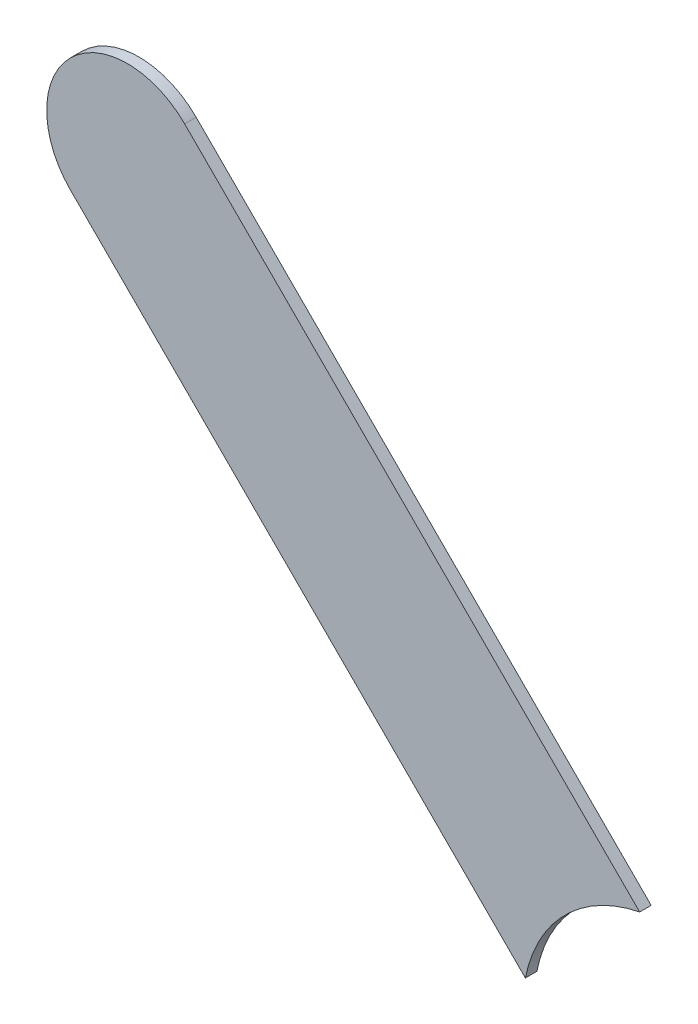
ISO-10303-21;
HEADER;
FILE_DESCRIPTION(('STEP AP214'),'2;1');
FILE_NAME('part.step','',(''),(''),'','','');
FILE_SCHEMA(('AUTOMOTIVE_DESIGN { 1 0 10303 214 1 1 1 1 }'));
ENDSEC;
DATA;
#1=APPLICATION_CONTEXT('core data for automotive mechanical design processes');
#2=APPLICATION_PROTOCOL_DEFINITION('international standard','automotive_design',2000,#1);
#3=PRODUCT_CONTEXT('',#1,'mechanical');
#4=PRODUCT('Part','Part','',(#3));
#5=PRODUCT_RELATED_PRODUCT_CATEGORY('part','',(#4));
#6=PRODUCT_DEFINITION_FORMATION('','',#4);
#7=PRODUCT_DEFINITION_CONTEXT('part definition',#1,'design');
#8=PRODUCT_DEFINITION('design','',#6,#7);
#9=PRODUCT_DEFINITION_SHAPE('','',#8);
#10=(LENGTH_UNIT() NAMED_UNIT(*) SI_UNIT(.MILLI.,.METRE.));
#11=(NAMED_UNIT(*) PLANE_ANGLE_UNIT() SI_UNIT($,.RADIAN.));
#12=(NAMED_UNIT(*) SI_UNIT($,.STERADIAN.) SOLID_ANGLE_UNIT());
#13=UNCERTAINTY_MEASURE_WITH_UNIT(LENGTH_MEASURE(1.E-05),#10,'distance_accuracy_value','');
#14=(GEOMETRIC_REPRESENTATION_CONTEXT(3) GLOBAL_UNCERTAINTY_ASSIGNED_CONTEXT((#13)) GLOBAL_UNIT_ASSIGNED_CONTEXT((#10,
#11,#12)) REPRESENTATION_CONTEXT('',''));
#15=CARTESIAN_POINT('',(0.,0.,0.));
#16=DIRECTION('',(0.,0.,1.));
#17=DIRECTION('',(1.,0.,0.));
#18=AXIS2_PLACEMENT_3D('',#15,#16,#17);
#19=CARTESIAN_POINT('',(46.2622392,105.82322244,0.));
#20=DIRECTION('',(0.707106781186546,0.707106781186549,0.));
#21=DIRECTION('',(0.707106781186549,-0.707106781186546,0.));
#22=AXIS2_PLACEMENT_3D('',#19,#20,#21);
#23=PLANE('',#22);
#24=DIRECTION('',(0.707106781186549,-0.707106781186546,0.));
#25=VECTOR('',#24,1.);
#26=CARTESIAN_POINT('',(46.2622392,105.82322244,0.03556));
#27=LINE('',#26,#25);
#28=CARTESIAN_POINT('',(46.2622392,105.82322244,0.03556));
#29=VERTEX_POINT('',#28);
#30=CARTESIAN_POINT('',(47.6696526436052,104.415808996395,0.03556));
#31=VERTEX_POINT('',#30);
#32=EDGE_CURVE('E11',#29,#31,#27,.T.);
#33=ORIENTED_EDGE('',*,*,#32,.F.);
#34=DIRECTION('',(0.,0.,1.));
#35=VECTOR('',#34,1.);
#36=CARTESIAN_POINT('',(46.2622392,105.82322244,0.));
#37=LINE('',#36,#35);
#38=CARTESIAN_POINT('',(46.2622392,105.82322244,0.));
#39=VERTEX_POINT('',#38);
#40=EDGE_CURVE('E24',#39,#29,#37,.T.);
#41=ORIENTED_EDGE('',*,*,#40,.F.);
#42=DIRECTION('',(0.707106781186549,-0.707106781186546,0.));
#43=VECTOR('',#42,1.);
#44=CARTESIAN_POINT('',(46.2622392,105.82322244,0.));
#45=LINE('',#44,#43);
#46=CARTESIAN_POINT('',(47.6696526436052,104.415808996395,0.));
#47=VERTEX_POINT('',#46);
#48=EDGE_CURVE('E75',#39,#47,#45,.T.);
#49=ORIENTED_EDGE('',*,*,#48,.T.);
#50=DIRECTION('',(0.,0.,1.));
#51=VECTOR('',#50,1.);
#52=CARTESIAN_POINT('',(47.6696526436052,104.415808996395,0.));
#53=LINE('',#52,#51);
#54=EDGE_CURVE('E37',#47,#31,#53,.T.);
#55=ORIENTED_EDGE('',*,*,#54,.T.);
#56=EDGE_LOOP('',(#33,#41,#49,#55));
#57=FACE_BOUND('',#56,.T.);
#58=ADVANCED_FACE('F17',(#57),#23,.F.);
#59=CARTESIAN_POINT('',(48.1110036,104.3280108,0.));
#60=DIRECTION('',(0.,0.,-1.));
#61=DIRECTION('',(1.,0.,0.));
#62=AXIS2_PLACEMENT_3D('',#59,#60,#61);
#63=CYLINDRICAL_SURFACE('',#62,0.4499991);
#64=DIRECTION('',(0.,0.,1.));
#65=VECTOR('',#64,1.);
#66=CARTESIAN_POINT('',(48.0232054036052,104.769361756395,0.));
#67=LINE('',#66,#65);
#68=CARTESIAN_POINT('',(48.0232054036052,104.769361756395,0.));
#69=VERTEX_POINT('',#68);
#70=CARTESIAN_POINT('',(48.0232054036052,104.769361756395,0.03556));
#71=VERTEX_POINT('',#70);
#72=EDGE_CURVE('E67',#69,#71,#67,.T.);
#73=ORIENTED_EDGE('',*,*,#72,.T.);
#74=CARTESIAN_POINT('',(48.1110036,104.3280108,0.03556));
#75=DIRECTION('',(0.,0.,1.));
#76=DIRECTION('',(1.,0.,0.));
#77=AXIS2_PLACEMENT_3D('',#74,#75,#76);
#78=CIRCLE('',#77,0.4499991);
#79=EDGE_CURVE('E82',#71,#31,#78,.T.);
#80=ORIENTED_EDGE('',*,*,#79,.T.);
#81=ORIENTED_EDGE('',*,*,#54,.F.);
#82=CARTESIAN_POINT('',(48.1110036,104.3280108,0.));
#83=DIRECTION('',(0.,0.,1.));
#84=DIRECTION('',(1.,0.,0.));
#85=AXIS2_PLACEMENT_3D('',#82,#83,#84);
#86=CIRCLE('',#85,0.4499991);
#87=EDGE_CURVE('E80',#69,#47,#86,.T.);
#88=ORIENTED_EDGE('',*,*,#87,.F.);
#89=EDGE_LOOP('',(#73,#80,#81,#88));
#90=FACE_BOUND('',#89,.T.);
#91=ADVANCED_FACE('F88',(#90),#63,.F.);
#92=CARTESIAN_POINT('',(48.0232054036052,104.769361756395,0.));
#93=DIRECTION('',(-0.707106781186545,-0.707106781186551,0.));
#94=DIRECTION('',(-0.707106781186551,0.707106781186545,0.));
#95=AXIS2_PLACEMENT_3D('',#92,#93,#94);
#96=PLANE('',#95);
#97=DIRECTION('',(-0.707106781186551,0.707106781186545,0.));
#98=VECTOR('',#97,1.);
#99=CARTESIAN_POINT('',(48.28777998,104.50478718,0.03556));
#100=LINE('',#99,#98);
#101=CARTESIAN_POINT('',(46.61579196,106.1767752,0.03556));
#102=VERTEX_POINT('',#101);
#103=EDGE_CURVE('E71',#71,#102,#100,.T.);
#104=ORIENTED_EDGE('',*,*,#103,.F.);
#105=ORIENTED_EDGE('',*,*,#72,.F.);
#106=DIRECTION('',(-0.707106781186551,0.707106781186545,0.));
#107=VECTOR('',#106,1.);
#108=CARTESIAN_POINT('',(48.28777998,104.50478718,0.));
#109=LINE('',#108,#107);
#110=CARTESIAN_POINT('',(46.61579196,106.1767752,0.));
#111=VERTEX_POINT('',#110);
#112=EDGE_CURVE('E63',#69,#111,#109,.T.);
#113=ORIENTED_EDGE('',*,*,#112,.T.);
#114=DIRECTION('',(0.,0.,1.));
#115=VECTOR('',#114,1.);
#116=CARTESIAN_POINT('',(46.61579196,106.1767752,0.));
#117=LINE('',#116,#115);
#118=EDGE_CURVE('E53',#111,#102,#117,.T.);
#119=ORIENTED_EDGE('',*,*,#118,.T.);
#120=EDGE_LOOP('',(#104,#105,#113,#119));
#121=FACE_BOUND('',#120,.T.);
#122=ADVANCED_FACE('F66',(#121),#96,.F.);
#123=CARTESIAN_POINT('',(46.43901558,105.99999882,0.));
#124=DIRECTION('',(0.,0.,-1.));
#125=DIRECTION('',(0.707106781186562,0.707106781186533,0.));
#126=AXIS2_PLACEMENT_3D('',#123,#124,#125);
#127=CYLINDRICAL_SURFACE('',#126,0.249999554103215);
#128=CARTESIAN_POINT('',(46.43901558,105.99999882,0.03556));
#129=DIRECTION('',(0.,0.,1.));
#130=DIRECTION('',(0.707106781186562,0.707106781186533,0.));
#131=AXIS2_PLACEMENT_3D('',#128,#129,#130);
#132=CIRCLE('',#131,0.249999554103215);
#133=EDGE_CURVE('E59',#102,#29,#132,.T.);
#134=ORIENTED_EDGE('',*,*,#133,.F.);
#135=ORIENTED_EDGE('',*,*,#118,.F.);
#136=CARTESIAN_POINT('',(46.43901558,105.99999882,0.));
#137=DIRECTION('',(0.,0.,1.));
#138=DIRECTION('',(0.707106781186562,0.707106781186533,0.));
#139=AXIS2_PLACEMENT_3D('',#136,#137,#138);
#140=CIRCLE('',#139,0.249999554103215);
#141=EDGE_CURVE('E57',#111,#39,#140,.T.);
#142=ORIENTED_EDGE('',*,*,#141,.T.);
#143=ORIENTED_EDGE('',*,*,#40,.T.);
#144=EDGE_LOOP('',(#134,#135,#142,#143));
#145=FACE_BOUND('',#144,.T.);
#146=ADVANCED_FACE('F55',(#145),#127,.T.);
#147=CARTESIAN_POINT('',(46.2622392,105.82322244,0.));
#148=DIRECTION('',(0.,0.,-1.));
#149=DIRECTION('',(-1.,0.,0.));
#150=AXIS2_PLACEMENT_3D('',#147,#148,#149);
#151=PLANE('',#150);
#152=ORIENTED_EDGE('',*,*,#48,.F.);
#153=ORIENTED_EDGE('',*,*,#141,.F.);
#154=ORIENTED_EDGE('',*,*,#112,.F.);
#155=ORIENTED_EDGE('',*,*,#87,.T.);
#156=EDGE_LOOP('',(#152,#153,#154,#155));
#157=FACE_BOUND('',#156,.T.);
#158=ADVANCED_FACE('F74',(#157),#151,.T.);
#159=CARTESIAN_POINT('',(46.2622392,105.82322244,0.03556));
#160=DIRECTION('',(0.,0.,-1.));
#161=DIRECTION('',(-1.,0.,0.));
#162=AXIS2_PLACEMENT_3D('',#159,#160,#161);
#163=PLANE('',#162);
#164=ORIENTED_EDGE('',*,*,#133,.T.);
#165=ORIENTED_EDGE('',*,*,#32,.T.);
#166=ORIENTED_EDGE('',*,*,#79,.F.);
#167=ORIENTED_EDGE('',*,*,#103,.T.);
#168=EDGE_LOOP('',(#164,#165,#166,#167));
#169=FACE_BOUND('',#168,.T.);
#170=ADVANCED_FACE('F91',(#169),#163,.F.);
#171=CLOSED_SHELL('',(#58,#91,#122,#146,#158,#170));
#172=MANIFOLD_SOLID_BREP('B1',#171);
#173=ADVANCED_BREP_SHAPE_REPRESENTATION('',(#18,#172),#14);
#174=SHAPE_DEFINITION_REPRESENTATION(#9,#173);
ENDSEC;
END-ISO-10303-21;
